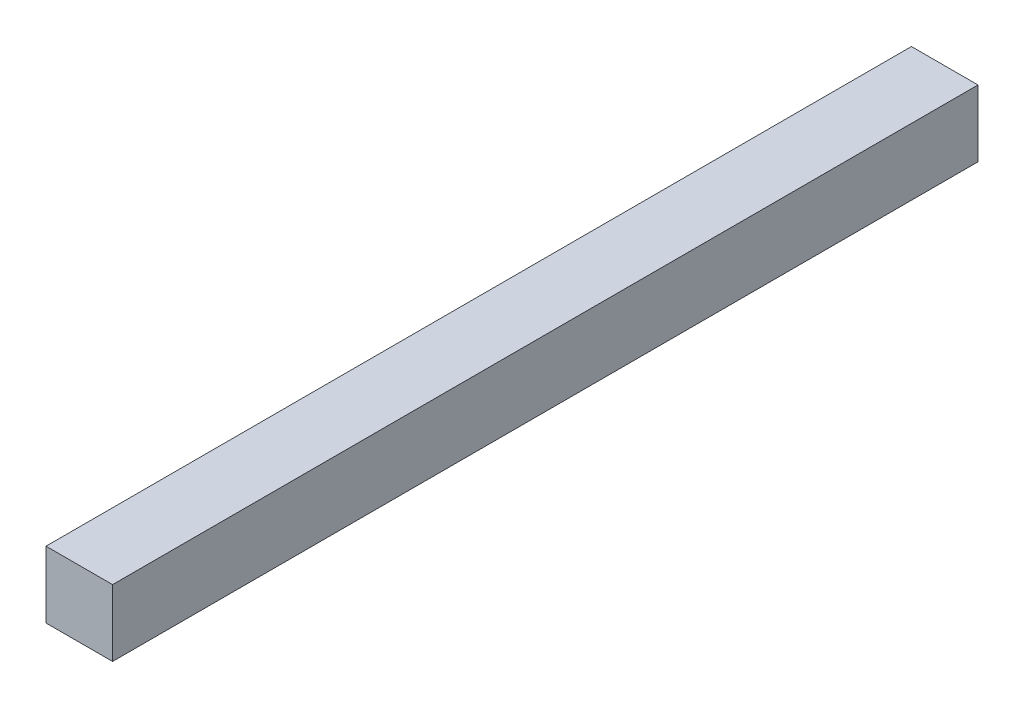
ISO-10303-21;
HEADER;
FILE_DESCRIPTION(('STEP AP214'),'2;1');
FILE_NAME('part.step','',(''),(''),'','','');
FILE_SCHEMA(('AUTOMOTIVE_DESIGN { 1 0 10303 214 1 1 1 1 }'));
ENDSEC;
DATA;
#1=APPLICATION_CONTEXT('core data for automotive mechanical design processes');
#2=APPLICATION_PROTOCOL_DEFINITION('international standard','automotive_design',2000,#1);
#3=PRODUCT_CONTEXT('',#1,'mechanical');
#4=PRODUCT('Part','Part','',(#3));
#5=PRODUCT_RELATED_PRODUCT_CATEGORY('part','',(#4));
#6=PRODUCT_DEFINITION_FORMATION('','',#4);
#7=PRODUCT_DEFINITION_CONTEXT('part definition',#1,'design');
#8=PRODUCT_DEFINITION('design','',#6,#7);
#9=PRODUCT_DEFINITION_SHAPE('','',#8);
#10=(LENGTH_UNIT() NAMED_UNIT(*) SI_UNIT(.MILLI.,.METRE.));
#11=(NAMED_UNIT(*) PLANE_ANGLE_UNIT() SI_UNIT($,.RADIAN.));
#12=(NAMED_UNIT(*) SI_UNIT($,.STERADIAN.) SOLID_ANGLE_UNIT());
#13=UNCERTAINTY_MEASURE_WITH_UNIT(LENGTH_MEASURE(1.E-05),#10,'distance_accuracy_value','');
#14=(GEOMETRIC_REPRESENTATION_CONTEXT(3) GLOBAL_UNCERTAINTY_ASSIGNED_CONTEXT((#13)) GLOBAL_UNIT_ASSIGNED_CONTEXT((#10,
#11,#12)) REPRESENTATION_CONTEXT('',''));
#15=CARTESIAN_POINT('',(0.,0.,0.));
#16=DIRECTION('',(0.,0.,1.));
#17=DIRECTION('',(1.,0.,0.));
#18=AXIS2_PLACEMENT_3D('',#15,#16,#17);
#19=CARTESIAN_POINT('',(0.,0.,33.02));
#20=DIRECTION('',(-1.,0.,0.));
#21=DIRECTION('',(0.,0.,1.));
#22=AXIS2_PLACEMENT_3D('',#19,#20,#21);
#23=PLANE('',#22);
#24=DIRECTION('',(0.,1.,0.));
#25=VECTOR('',#24,1.);
#26=CARTESIAN_POINT('',(0.,0.,0.));
#27=LINE('',#26,#25);
#28=CARTESIAN_POINT('',(0.,0.,0.));
#29=VERTEX_POINT('',#28);
#30=CARTESIAN_POINT('',(0.,2.54,0.));
#31=VERTEX_POINT('',#30);
#32=EDGE_CURVE('E107',#29,#31,#27,.T.);
#33=ORIENTED_EDGE('',*,*,#32,.T.);
#34=DIRECTION('',(0.,0.,-1.));
#35=VECTOR('',#34,1.);
#36=CARTESIAN_POINT('',(0.,2.54,33.02));
#37=LINE('',#36,#35);
#38=CARTESIAN_POINT('',(0.,2.54,33.02));
#39=VERTEX_POINT('',#38);
#40=EDGE_CURVE('E11',#39,#31,#37,.T.);
#41=ORIENTED_EDGE('',*,*,#40,.F.);
#42=DIRECTION('',(0.,1.,0.));
#43=VECTOR('',#42,1.);
#44=CARTESIAN_POINT('',(0.,0.,33.02));
#45=LINE('',#44,#43);
#46=CARTESIAN_POINT('',(0.,0.,33.02));
#47=VERTEX_POINT('',#46);
#48=EDGE_CURVE('E91',#47,#39,#45,.T.);
#49=ORIENTED_EDGE('',*,*,#48,.F.);
#50=DIRECTION('',(0.,0.,-1.));
#51=VECTOR('',#50,1.);
#52=CARTESIAN_POINT('',(0.,0.,33.02));
#53=LINE('',#52,#51);
#54=EDGE_CURVE('E103',#47,#29,#53,.T.);
#55=ORIENTED_EDGE('',*,*,#54,.T.);
#56=EDGE_LOOP('',(#33,#41,#49,#55));
#57=FACE_BOUND('',#56,.T.);
#58=ADVANCED_FACE('F39',(#57),#23,.F.);
#59=CARTESIAN_POINT('',(0.,2.54,33.02));
#60=DIRECTION('',(0.,-1.,0.));
#61=DIRECTION('',(1.,0.,0.));
#62=AXIS2_PLACEMENT_3D('',#59,#60,#61);
#63=PLANE('',#62);
#64=DIRECTION('',(-1.,0.,0.));
#65=VECTOR('',#64,1.);
#66=CARTESIAN_POINT('',(0.,2.54,0.));
#67=LINE('',#66,#65);
#68=CARTESIAN_POINT('',(-2.54,2.54,0.));
#69=VERTEX_POINT('',#68);
#70=EDGE_CURVE('E96',#31,#69,#67,.T.);
#71=ORIENTED_EDGE('',*,*,#70,.T.);
#72=DIRECTION('',(0.,0.,-1.));
#73=VECTOR('',#72,1.);
#74=CARTESIAN_POINT('',(-2.54,2.54,33.02));
#75=LINE('',#74,#73);
#76=CARTESIAN_POINT('',(-2.54,2.54,33.02));
#77=VERTEX_POINT('',#76);
#78=EDGE_CURVE('E48',#77,#69,#75,.T.);
#79=ORIENTED_EDGE('',*,*,#78,.F.);
#80=DIRECTION('',(-1.,0.,0.));
#81=VECTOR('',#80,1.);
#82=CARTESIAN_POINT('',(0.,2.54,33.02));
#83=LINE('',#82,#81);
#84=EDGE_CURVE('E86',#39,#77,#83,.T.);
#85=ORIENTED_EDGE('',*,*,#84,.F.);
#86=ORIENTED_EDGE('',*,*,#40,.T.);
#87=EDGE_LOOP('',(#71,#79,#85,#86));
#88=FACE_BOUND('',#87,.T.);
#89=ADVANCED_FACE('F95',(#88),#63,.F.);
#90=CARTESIAN_POINT('',(-2.54,0.,33.02));
#91=DIRECTION('',(1.,0.,0.));
#92=DIRECTION('',(0.,0.,-1.));
#93=AXIS2_PLACEMENT_3D('',#90,#91,#92);
#94=PLANE('',#93);
#95=DIRECTION('',(0.,-1.,0.));
#96=VECTOR('',#95,1.);
#97=CARTESIAN_POINT('',(-2.54,0.,0.));
#98=LINE('',#97,#96);
#99=CARTESIAN_POINT('',(-2.54,0.,0.));
#100=VERTEX_POINT('',#99);
#101=EDGE_CURVE('E73',#69,#100,#98,.T.);
#102=ORIENTED_EDGE('',*,*,#101,.T.);
#103=DIRECTION('',(0.,0.,-1.));
#104=VECTOR('',#103,1.);
#105=CARTESIAN_POINT('',(-2.54,0.,33.02));
#106=LINE('',#105,#104);
#107=CARTESIAN_POINT('',(-2.54,0.,33.02));
#108=VERTEX_POINT('',#107);
#109=EDGE_CURVE('E98',#108,#100,#106,.T.);
#110=ORIENTED_EDGE('',*,*,#109,.F.);
#111=DIRECTION('',(0.,-1.,0.));
#112=VECTOR('',#111,1.);
#113=CARTESIAN_POINT('',(-2.54,0.,33.02));
#114=LINE('',#113,#112);
#115=EDGE_CURVE('E89',#77,#108,#114,.T.);
#116=ORIENTED_EDGE('',*,*,#115,.F.);
#117=ORIENTED_EDGE('',*,*,#78,.T.);
#118=EDGE_LOOP('',(#102,#110,#116,#117));
#119=FACE_BOUND('',#118,.T.);
#120=ADVANCED_FACE('F99',(#119),#94,.F.);
#121=CARTESIAN_POINT('',(0.,0.,33.02));
#122=DIRECTION('',(0.,1.,0.));
#123=DIRECTION('',(-1.,0.,0.));
#124=AXIS2_PLACEMENT_3D('',#121,#122,#123);
#125=PLANE('',#124);
#126=DIRECTION('',(1.,0.,0.));
#127=VECTOR('',#126,1.);
#128=CARTESIAN_POINT('',(0.,0.,0.));
#129=LINE('',#128,#127);
#130=EDGE_CURVE('E79',#100,#29,#129,.T.);
#131=ORIENTED_EDGE('',*,*,#130,.T.);
#132=ORIENTED_EDGE('',*,*,#54,.F.);
#133=DIRECTION('',(1.,0.,0.));
#134=VECTOR('',#133,1.);
#135=CARTESIAN_POINT('',(0.,0.,33.02));
#136=LINE('',#135,#134);
#137=EDGE_CURVE('E56',#108,#47,#136,.T.);
#138=ORIENTED_EDGE('',*,*,#137,.F.);
#139=ORIENTED_EDGE('',*,*,#109,.T.);
#140=EDGE_LOOP('',(#131,#132,#138,#139));
#141=FACE_BOUND('',#140,.T.);
#142=ADVANCED_FACE('F120',(#141),#125,.F.);
#143=CARTESIAN_POINT('',(0.,0.,33.02));
#144=DIRECTION('',(0.,0.,1.));
#145=DIRECTION('',(1.,0.,0.));
#146=AXIS2_PLACEMENT_3D('',#143,#144,#145);
#147=PLANE('',#146);
#148=ORIENTED_EDGE('',*,*,#48,.T.);
#149=ORIENTED_EDGE('',*,*,#84,.T.);
#150=ORIENTED_EDGE('',*,*,#115,.T.);
#151=ORIENTED_EDGE('',*,*,#137,.T.);
#152=EDGE_LOOP('',(#148,#149,#150,#151));
#153=FACE_BOUND('',#152,.T.);
#154=ADVANCED_FACE('F87',(#153),#147,.T.);
#155=CARTESIAN_POINT('',(0.,0.,0.));
#156=DIRECTION('',(0.,0.,1.));
#157=DIRECTION('',(1.,0.,0.));
#158=AXIS2_PLACEMENT_3D('',#155,#156,#157);
#159=PLANE('',#158);
#160=ORIENTED_EDGE('',*,*,#32,.F.);
#161=ORIENTED_EDGE('',*,*,#130,.F.);
#162=ORIENTED_EDGE('',*,*,#101,.F.);
#163=ORIENTED_EDGE('',*,*,#70,.F.);
#164=EDGE_LOOP('',(#160,#161,#162,#163));
#165=FACE_BOUND('',#164,.T.);
#166=ADVANCED_FACE('F123',(#165),#159,.F.);
#167=CLOSED_SHELL('',(#58,#89,#120,#142,#154,#166));
#168=MANIFOLD_SOLID_BREP('B2',#167);
#169=ADVANCED_BREP_SHAPE_REPRESENTATION('',(#18,#168),#14);
#170=SHAPE_DEFINITION_REPRESENTATION(#9,#169);
ENDSEC;
END-ISO-10303-21;
